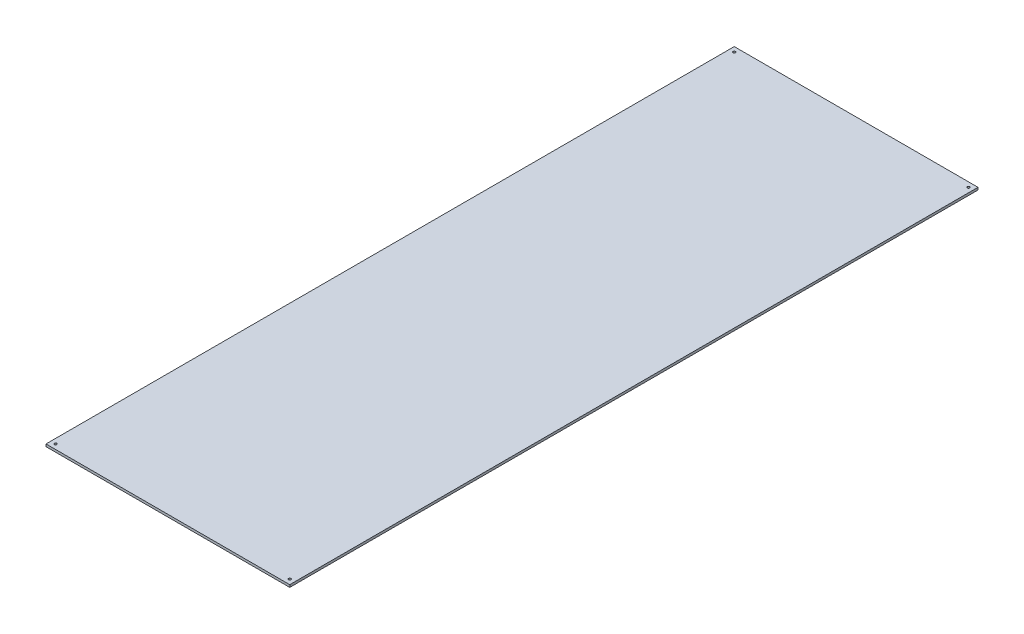
ISO-10303-21;
HEADER;
FILE_DESCRIPTION(('STEP AP214'),'2;1');
FILE_NAME('part.step','',(''),(''),'','','');
FILE_SCHEMA(('AUTOMOTIVE_DESIGN { 1 0 10303 214 1 1 1 1 }'));
ENDSEC;
DATA;
#1=APPLICATION_CONTEXT('core data for automotive mechanical design processes');
#2=APPLICATION_PROTOCOL_DEFINITION('international standard','automotive_design',2000,#1);
#3=PRODUCT_CONTEXT('',#1,'mechanical');
#4=PRODUCT('Part','Part','',(#3));
#5=PRODUCT_RELATED_PRODUCT_CATEGORY('part','',(#4));
#6=PRODUCT_DEFINITION_FORMATION('','',#4);
#7=PRODUCT_DEFINITION_CONTEXT('part definition',#1,'design');
#8=PRODUCT_DEFINITION('design','',#6,#7);
#9=PRODUCT_DEFINITION_SHAPE('','',#8);
#10=(LENGTH_UNIT() NAMED_UNIT(*) SI_UNIT(.MILLI.,.METRE.));
#11=(NAMED_UNIT(*) PLANE_ANGLE_UNIT() SI_UNIT($,.RADIAN.));
#12=(NAMED_UNIT(*) SI_UNIT($,.STERADIAN.) SOLID_ANGLE_UNIT());
#13=UNCERTAINTY_MEASURE_WITH_UNIT(LENGTH_MEASURE(1.E-05),#10,'distance_accuracy_value','');
#14=(GEOMETRIC_REPRESENTATION_CONTEXT(3) GLOBAL_UNCERTAINTY_ASSIGNED_CONTEXT((#13)) GLOBAL_UNIT_ASSIGNED_CONTEXT((#10,
#11,#12)) REPRESENTATION_CONTEXT('',''));
#15=CARTESIAN_POINT('',(0.,0.,0.));
#16=DIRECTION('',(0.,0.,1.));
#17=DIRECTION('',(1.,0.,0.));
#18=AXIS2_PLACEMENT_3D('',#15,#16,#17);
#19=CARTESIAN_POINT('',(323.85,6.35,914.4));
#20=DIRECTION('',(-1.,0.,0.));
#21=DIRECTION('',(0.,0.,1.));
#22=AXIS2_PLACEMENT_3D('',#19,#20,#21);
#23=PLANE('',#22);
#24=DIRECTION('',(0.,0.,-1.));
#25=VECTOR('',#24,1.);
#26=CARTESIAN_POINT('',(323.85,0.,914.4));
#27=LINE('',#26,#25);
#28=CARTESIAN_POINT('',(323.85,0.,914.4));
#29=VERTEX_POINT('',#28);
#30=CARTESIAN_POINT('',(323.85,0.,-914.4));
#31=VERTEX_POINT('',#30);
#32=EDGE_CURVE('E111',#29,#31,#27,.T.);
#33=ORIENTED_EDGE('',*,*,#32,.T.);
#34=DIRECTION('',(0.,-1.,0.));
#35=VECTOR('',#34,1.);
#36=CARTESIAN_POINT('',(323.85,6.35,-914.4));
#37=LINE('',#36,#35);
#38=CARTESIAN_POINT('',(323.85,6.35,-914.4));
#39=VERTEX_POINT('',#38);
#40=EDGE_CURVE('E11',#39,#31,#37,.T.);
#41=ORIENTED_EDGE('',*,*,#40,.F.);
#42=DIRECTION('',(0.,0.,-1.));
#43=VECTOR('',#42,1.);
#44=CARTESIAN_POINT('',(323.85,6.35,914.4));
#45=LINE('',#44,#43);
#46=CARTESIAN_POINT('',(323.85,6.35,914.4));
#47=VERTEX_POINT('',#46);
#48=EDGE_CURVE('E95',#47,#39,#45,.T.);
#49=ORIENTED_EDGE('',*,*,#48,.F.);
#50=DIRECTION('',(0.,-1.,0.));
#51=VECTOR('',#50,1.);
#52=CARTESIAN_POINT('',(323.85,6.35,914.4));
#53=LINE('',#52,#51);
#54=EDGE_CURVE('E107',#47,#29,#53,.T.);
#55=ORIENTED_EDGE('',*,*,#54,.T.);
#56=EDGE_LOOP('',(#33,#41,#49,#55));
#57=FACE_BOUND('',#56,.T.);
#58=ADVANCED_FACE('F43',(#57),#23,.F.);
#59=CARTESIAN_POINT('',(-323.85,6.35,-914.4));
#60=DIRECTION('',(0.,0.,1.));
#61=DIRECTION('',(1.,0.,0.));
#62=AXIS2_PLACEMENT_3D('',#59,#60,#61);
#63=PLANE('',#62);
#64=DIRECTION('',(-1.,0.,0.));
#65=VECTOR('',#64,1.);
#66=CARTESIAN_POINT('',(-323.85,0.,-914.4));
#67=LINE('',#66,#65);
#68=CARTESIAN_POINT('',(-323.85,0.,-914.4));
#69=VERTEX_POINT('',#68);
#70=EDGE_CURVE('E100',#31,#69,#67,.T.);
#71=ORIENTED_EDGE('',*,*,#70,.T.);
#72=DIRECTION('',(0.,-1.,0.));
#73=VECTOR('',#72,1.);
#74=CARTESIAN_POINT('',(-323.85,6.35,-914.4));
#75=LINE('',#74,#73);
#76=CARTESIAN_POINT('',(-323.85,6.35,-914.4));
#77=VERTEX_POINT('',#76);
#78=EDGE_CURVE('E52',#77,#69,#75,.T.);
#79=ORIENTED_EDGE('',*,*,#78,.F.);
#80=DIRECTION('',(-1.,0.,0.));
#81=VECTOR('',#80,1.);
#82=CARTESIAN_POINT('',(-323.85,6.35,-914.4));
#83=LINE('',#82,#81);
#84=EDGE_CURVE('E90',#39,#77,#83,.T.);
#85=ORIENTED_EDGE('',*,*,#84,.F.);
#86=ORIENTED_EDGE('',*,*,#40,.T.);
#87=EDGE_LOOP('',(#71,#79,#85,#86));
#88=FACE_BOUND('',#87,.T.);
#89=ADVANCED_FACE('F99',(#88),#63,.F.);
#90=CARTESIAN_POINT('',(-323.85,6.35,914.4));
#91=DIRECTION('',(1.,0.,0.));
#92=DIRECTION('',(0.,0.,-1.));
#93=AXIS2_PLACEMENT_3D('',#90,#91,#92);
#94=PLANE('',#93);
#95=DIRECTION('',(0.,0.,1.));
#96=VECTOR('',#95,1.);
#97=CARTESIAN_POINT('',(-323.85,0.,914.4));
#98=LINE('',#97,#96);
#99=CARTESIAN_POINT('',(-323.85,0.,914.4));
#100=VERTEX_POINT('',#99);
#101=EDGE_CURVE('E77',#69,#100,#98,.T.);
#102=ORIENTED_EDGE('',*,*,#101,.T.);
#103=DIRECTION('',(0.,-1.,0.));
#104=VECTOR('',#103,1.);
#105=CARTESIAN_POINT('',(-323.85,6.35,914.4));
#106=LINE('',#105,#104);
#107=CARTESIAN_POINT('',(-323.85,6.35,914.4));
#108=VERTEX_POINT('',#107);
#109=EDGE_CURVE('E102',#108,#100,#106,.T.);
#110=ORIENTED_EDGE('',*,*,#109,.F.);
#111=DIRECTION('',(0.,0.,1.));
#112=VECTOR('',#111,1.);
#113=CARTESIAN_POINT('',(-323.85,6.35,914.4));
#114=LINE('',#113,#112);
#115=EDGE_CURVE('E93',#77,#108,#114,.T.);
#116=ORIENTED_EDGE('',*,*,#115,.F.);
#117=ORIENTED_EDGE('',*,*,#78,.T.);
#118=EDGE_LOOP('',(#102,#110,#116,#117));
#119=FACE_BOUND('',#118,.T.);
#120=ADVANCED_FACE('F103',(#119),#94,.F.);
#121=CARTESIAN_POINT('',(-323.85,6.35,914.4));
#122=DIRECTION('',(0.,0.,-1.));
#123=DIRECTION('',(-1.,0.,0.));
#124=AXIS2_PLACEMENT_3D('',#121,#122,#123);
#125=PLANE('',#124);
#126=DIRECTION('',(1.,0.,0.));
#127=VECTOR('',#126,1.);
#128=CARTESIAN_POINT('',(-323.85,0.,914.4));
#129=LINE('',#128,#127);
#130=EDGE_CURVE('E83',#100,#29,#129,.T.);
#131=ORIENTED_EDGE('',*,*,#130,.T.);
#132=ORIENTED_EDGE('',*,*,#54,.F.);
#133=DIRECTION('',(1.,0.,0.));
#134=VECTOR('',#133,1.);
#135=CARTESIAN_POINT('',(-323.85,6.35,914.4));
#136=LINE('',#135,#134);
#137=EDGE_CURVE('E60',#108,#47,#136,.T.);
#138=ORIENTED_EDGE('',*,*,#137,.F.);
#139=ORIENTED_EDGE('',*,*,#109,.T.);
#140=EDGE_LOOP('',(#131,#132,#138,#139));
#141=FACE_BOUND('',#140,.T.);
#142=ADVANCED_FACE('F125',(#141),#125,.F.);
#143=CARTESIAN_POINT('',(0.,6.35,0.));
#144=DIRECTION('',(0.,-1.,0.));
#145=DIRECTION('',(0.,0.,-1.));
#146=AXIS2_PLACEMENT_3D('',#143,#144,#145);
#147=PLANE('',#146);
#148=CARTESIAN_POINT('',(-311.15,6.35,901.7));
#149=DIRECTION('',(0.,1.,0.));
#150=DIRECTION('',(0.,0.,1.));
#151=AXIS2_PLACEMENT_3D('',#148,#149,#150);
#152=CIRCLE('',#151,3.17499999999997);
#153=CARTESIAN_POINT('',(-311.15,6.35,904.875));
#154=VERTEX_POINT('',#153);
#155=EDGE_CURVE('E136',#154,#154,#152,.T.);
#156=ORIENTED_EDGE('',*,*,#155,.F.);
#157=EDGE_LOOP('',(#156));
#158=FACE_BOUND('',#157,.T.);
#159=CARTESIAN_POINT('',(311.15,6.35,-901.700000000001));
#160=DIRECTION('',(0.,1.,0.));
#161=DIRECTION('',(0.,0.,1.));
#162=AXIS2_PLACEMENT_3D('',#159,#160,#161);
#163=CIRCLE('',#162,3.17499999999997);
#164=CARTESIAN_POINT('',(311.15,6.35,-898.525000000001));
#165=VERTEX_POINT('',#164);
#166=EDGE_CURVE('E144',#165,#165,#163,.T.);
#167=ORIENTED_EDGE('',*,*,#166,.F.);
#168=EDGE_LOOP('',(#167));
#169=FACE_BOUND('',#168,.T.);
#170=CARTESIAN_POINT('',(-311.15,6.35,-901.7));
#171=DIRECTION('',(0.,1.,0.));
#172=DIRECTION('',(0.,0.,1.));
#173=AXIS2_PLACEMENT_3D('',#170,#171,#172);
#174=CIRCLE('',#173,3.17499999999997);
#175=CARTESIAN_POINT('',(-311.15,6.35,-898.525));
#176=VERTEX_POINT('',#175);
#177=EDGE_CURVE('E145',#176,#176,#174,.T.);
#178=ORIENTED_EDGE('',*,*,#177,.F.);
#179=EDGE_LOOP('',(#178));
#180=FACE_BOUND('',#179,.T.);
#181=CARTESIAN_POINT('',(311.15,6.35,901.7));
#182=DIRECTION('',(0.,1.,0.));
#183=DIRECTION('',(0.,0.,1.));
#184=AXIS2_PLACEMENT_3D('',#181,#182,#183);
#185=CIRCLE('',#184,3.17499999999997);
#186=CARTESIAN_POINT('',(311.15,6.35,904.875));
#187=VERTEX_POINT('',#186);
#188=EDGE_CURVE('E132',#187,#187,#185,.T.);
#189=ORIENTED_EDGE('',*,*,#188,.F.);
#190=EDGE_LOOP('',(#189));
#191=FACE_BOUND('',#190,.T.);
#192=ORIENTED_EDGE('',*,*,#48,.T.);
#193=ORIENTED_EDGE('',*,*,#84,.T.);
#194=ORIENTED_EDGE('',*,*,#115,.T.);
#195=ORIENTED_EDGE('',*,*,#137,.T.);
#196=EDGE_LOOP('',(#192,#193,#194,#195));
#197=FACE_BOUND('',#196,.T.);
#198=ADVANCED_FACE('F91',(#158,#169,#180,#191,#197),#147,.F.);
#199=CARTESIAN_POINT('',(0.,0.,0.));
#200=DIRECTION('',(0.,-1.,0.));
#201=DIRECTION('',(0.,0.,-1.));
#202=AXIS2_PLACEMENT_3D('',#199,#200,#201);
#203=PLANE('',#202);
#204=CARTESIAN_POINT('',(-311.15,0.,901.7));
#205=DIRECTION('',(0.,1.,0.));
#206=DIRECTION('',(0.,0.,1.));
#207=AXIS2_PLACEMENT_3D('',#204,#205,#206);
#208=CIRCLE('',#207,3.17499999999997);
#209=CARTESIAN_POINT('',(-311.15,0.,904.875));
#210=VERTEX_POINT('',#209);
#211=EDGE_CURVE('E149',#210,#210,#208,.T.);
#212=ORIENTED_EDGE('',*,*,#211,.T.);
#213=EDGE_LOOP('',(#212));
#214=FACE_BOUND('',#213,.T.);
#215=CARTESIAN_POINT('',(311.15,0.,-901.700000000001));
#216=DIRECTION('',(0.,1.,0.));
#217=DIRECTION('',(0.,0.,1.));
#218=AXIS2_PLACEMENT_3D('',#215,#216,#217);
#219=CIRCLE('',#218,3.17499999999997);
#220=CARTESIAN_POINT('',(311.15,0.,-898.525000000001));
#221=VERTEX_POINT('',#220);
#222=EDGE_CURVE('E140',#221,#221,#219,.T.);
#223=ORIENTED_EDGE('',*,*,#222,.T.);
#224=EDGE_LOOP('',(#223));
#225=FACE_BOUND('',#224,.T.);
#226=CARTESIAN_POINT('',(-311.15,0.,-901.7));
#227=DIRECTION('',(0.,1.,0.));
#228=DIRECTION('',(0.,0.,1.));
#229=AXIS2_PLACEMENT_3D('',#226,#227,#228);
#230=CIRCLE('',#229,3.17499999999997);
#231=CARTESIAN_POINT('',(-311.15,0.,-898.525));
#232=VERTEX_POINT('',#231);
#233=EDGE_CURVE('E156',#232,#232,#230,.T.);
#234=ORIENTED_EDGE('',*,*,#233,.T.);
#235=EDGE_LOOP('',(#234));
#236=FACE_BOUND('',#235,.T.);
#237=CARTESIAN_POINT('',(311.15,0.,901.7));
#238=DIRECTION('',(0.,1.,0.));
#239=DIRECTION('',(0.,0.,1.));
#240=AXIS2_PLACEMENT_3D('',#237,#238,#239);
#241=CIRCLE('',#240,3.17499999999997);
#242=CARTESIAN_POINT('',(311.15,0.,904.875));
#243=VERTEX_POINT('',#242);
#244=EDGE_CURVE('E115',#243,#243,#241,.T.);
#245=ORIENTED_EDGE('',*,*,#244,.T.);
#246=EDGE_LOOP('',(#245));
#247=FACE_BOUND('',#246,.T.);
#248=ORIENTED_EDGE('',*,*,#32,.F.);
#249=ORIENTED_EDGE('',*,*,#130,.F.);
#250=ORIENTED_EDGE('',*,*,#101,.F.);
#251=ORIENTED_EDGE('',*,*,#70,.F.);
#252=EDGE_LOOP('',(#248,#249,#250,#251));
#253=FACE_BOUND('',#252,.T.);
#254=ADVANCED_FACE('F128',(#214,#225,#236,#247,#253),#203,.T.);
#255=CARTESIAN_POINT('',(311.15,0.,901.7));
#256=DIRECTION('',(0.,1.,0.));
#257=DIRECTION('',(0.,0.,1.));
#258=AXIS2_PLACEMENT_3D('',#255,#256,#257);
#259=CYLINDRICAL_SURFACE('',#258,3.17499999999997);
#260=ORIENTED_EDGE('',*,*,#244,.F.);
#261=EDGE_LOOP('',(#260));
#262=FACE_BOUND('',#261,.T.);
#263=ORIENTED_EDGE('',*,*,#188,.T.);
#264=EDGE_LOOP('',(#263));
#265=FACE_BOUND('',#264,.T.);
#266=ADVANCED_FACE('F172',(#262,#265),#259,.F.);
#267=CARTESIAN_POINT('',(-311.15,0.,-901.7));
#268=DIRECTION('',(0.,1.,0.));
#269=DIRECTION('',(0.,0.,1.));
#270=AXIS2_PLACEMENT_3D('',#267,#268,#269);
#271=CYLINDRICAL_SURFACE('',#270,3.17499999999997);
#272=ORIENTED_EDGE('',*,*,#233,.F.);
#273=EDGE_LOOP('',(#272));
#274=FACE_BOUND('',#273,.T.);
#275=ORIENTED_EDGE('',*,*,#177,.T.);
#276=EDGE_LOOP('',(#275));
#277=FACE_BOUND('',#276,.T.);
#278=ADVANCED_FACE('F164',(#274,#277),#271,.F.);
#279=CARTESIAN_POINT('',(311.15,0.,-901.700000000001));
#280=DIRECTION('',(0.,1.,0.));
#281=DIRECTION('',(0.,0.,1.));
#282=AXIS2_PLACEMENT_3D('',#279,#280,#281);
#283=CYLINDRICAL_SURFACE('',#282,3.17499999999997);
#284=ORIENTED_EDGE('',*,*,#222,.F.);
#285=EDGE_LOOP('',(#284));
#286=FACE_BOUND('',#285,.T.);
#287=ORIENTED_EDGE('',*,*,#166,.T.);
#288=EDGE_LOOP('',(#287));
#289=FACE_BOUND('',#288,.T.);
#290=ADVANCED_FACE('F180',(#286,#289),#283,.F.);
#291=CARTESIAN_POINT('',(-311.15,0.,901.7));
#292=DIRECTION('',(0.,1.,0.));
#293=DIRECTION('',(0.,0.,1.));
#294=AXIS2_PLACEMENT_3D('',#291,#292,#293);
#295=CYLINDRICAL_SURFACE('',#294,3.17499999999997);
#296=ORIENTED_EDGE('',*,*,#211,.F.);
#297=EDGE_LOOP('',(#296));
#298=FACE_BOUND('',#297,.T.);
#299=ORIENTED_EDGE('',*,*,#155,.T.);
#300=EDGE_LOOP('',(#299));
#301=FACE_BOUND('',#300,.T.);
#302=ADVANCED_FACE('F231',(#298,#301),#295,.F.);
#303=CLOSED_SHELL('',(#58,#89,#120,#142,#198,#254,#266,#278,#290,#302));
#304=MANIFOLD_SOLID_BREP('B2',#303);
#305=ADVANCED_BREP_SHAPE_REPRESENTATION('',(#18,#304),#14);
#306=SHAPE_DEFINITION_REPRESENTATION(#9,#305);
ENDSEC;
END-ISO-10303-21;
